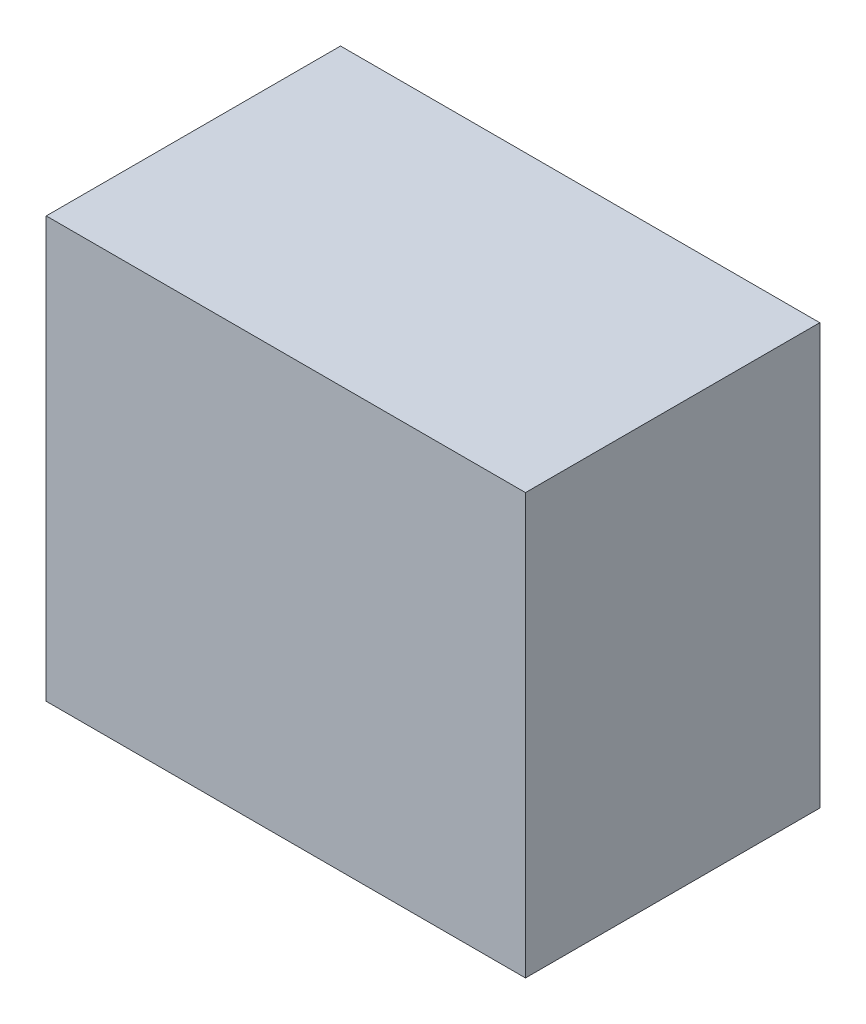
ISO-10303-21;
HEADER;
FILE_DESCRIPTION(('STEP AP214'),'2;1');
FILE_NAME('part.step','',(''),(''),'','','');
FILE_SCHEMA(('AUTOMOTIVE_DESIGN { 1 0 10303 214 1 1 1 1 }'));
ENDSEC;
DATA;
#1=APPLICATION_CONTEXT('core data for automotive mechanical design processes');
#2=APPLICATION_PROTOCOL_DEFINITION('international standard','automotive_design',2000,#1);
#3=PRODUCT_CONTEXT('',#1,'mechanical');
#4=PRODUCT('Part','Part','',(#3));
#5=PRODUCT_RELATED_PRODUCT_CATEGORY('part','',(#4));
#6=PRODUCT_DEFINITION_FORMATION('','',#4);
#7=PRODUCT_DEFINITION_CONTEXT('part definition',#1,'design');
#8=PRODUCT_DEFINITION('design','',#6,#7);
#9=PRODUCT_DEFINITION_SHAPE('','',#8);
#10=(LENGTH_UNIT() NAMED_UNIT(*) SI_UNIT(.MILLI.,.METRE.));
#11=(NAMED_UNIT(*) PLANE_ANGLE_UNIT() SI_UNIT($,.RADIAN.));
#12=(NAMED_UNIT(*) SI_UNIT($,.STERADIAN.) SOLID_ANGLE_UNIT());
#13=UNCERTAINTY_MEASURE_WITH_UNIT(LENGTH_MEASURE(1.E-05),#10,'distance_accuracy_value','');
#14=(GEOMETRIC_REPRESENTATION_CONTEXT(3) GLOBAL_UNCERTAINTY_ASSIGNED_CONTEXT((#13)) GLOBAL_UNIT_ASSIGNED_CONTEXT((#10,
#11,#12)) REPRESENTATION_CONTEXT('',''));
#15=CARTESIAN_POINT('',(0.,0.,0.));
#16=DIRECTION('',(0.,0.,1.));
#17=DIRECTION('',(1.,0.,0.));
#18=AXIS2_PLACEMENT_3D('',#15,#16,#17);
#19=CARTESIAN_POINT('',(28.5,50.,-17.5));
#20=DIRECTION('',(-1.,0.,0.));
#21=DIRECTION('',(0.,0.,1.));
#22=AXIS2_PLACEMENT_3D('',#19,#20,#21);
#23=PLANE('',#22);
#24=DIRECTION('',(0.,0.,-1.));
#25=VECTOR('',#24,1.);
#26=CARTESIAN_POINT('',(28.5,0.,-17.5));
#27=LINE('',#26,#25);
#28=CARTESIAN_POINT('',(28.5,0.,17.5));
#29=VERTEX_POINT('',#28);
#30=CARTESIAN_POINT('',(28.5,0.,-17.5));
#31=VERTEX_POINT('',#30);
#32=EDGE_CURVE('E148',#29,#31,#27,.T.);
#33=ORIENTED_EDGE('',*,*,#32,.T.);
#34=DIRECTION('',(0.,-1.,0.));
#35=VECTOR('',#34,1.);
#36=CARTESIAN_POINT('',(28.5,50.,-17.5));
#37=LINE('',#36,#35);
#38=CARTESIAN_POINT('',(28.5,50.,-17.5));
#39=VERTEX_POINT('',#38);
#40=EDGE_CURVE('E11',#39,#31,#37,.T.);
#41=ORIENTED_EDGE('',*,*,#40,.F.);
#42=DIRECTION('',(0.,0.,-1.));
#43=VECTOR('',#42,1.);
#44=CARTESIAN_POINT('',(28.5,50.,-17.5));
#45=LINE('',#44,#43);
#46=CARTESIAN_POINT('',(28.5,50.,17.5));
#47=VERTEX_POINT('',#46);
#48=EDGE_CURVE('E160',#47,#39,#45,.T.);
#49=ORIENTED_EDGE('',*,*,#48,.F.);
#50=DIRECTION('',(0.,-1.,0.));
#51=VECTOR('',#50,1.);
#52=CARTESIAN_POINT('',(28.5,50.,17.5));
#53=LINE('',#52,#51);
#54=EDGE_CURVE('E169',#47,#29,#53,.T.);
#55=ORIENTED_EDGE('',*,*,#54,.T.);
#56=EDGE_LOOP('',(#33,#41,#49,#55));
#57=FACE_BOUND('',#56,.T.);
#58=ADVANCED_FACE('F46',(#57),#23,.F.);
#59=CARTESIAN_POINT('',(-28.5,50.,-17.5));
#60=DIRECTION('',(0.,0.,1.));
#61=DIRECTION('',(1.,0.,0.));
#62=AXIS2_PLACEMENT_3D('',#59,#60,#61);
#63=PLANE('',#62);
#64=DIRECTION('',(-1.,0.,0.));
#65=VECTOR('',#64,1.);
#66=CARTESIAN_POINT('',(-28.5,0.,-17.5));
#67=LINE('',#66,#65);
#68=CARTESIAN_POINT('',(-28.5,0.,-17.5));
#69=VERTEX_POINT('',#68);
#70=EDGE_CURVE('E154',#31,#69,#67,.T.);
#71=ORIENTED_EDGE('',*,*,#70,.T.);
#72=DIRECTION('',(0.,-1.,0.));
#73=VECTOR('',#72,1.);
#74=CARTESIAN_POINT('',(-28.5,50.,-17.5));
#75=LINE('',#74,#73);
#76=CARTESIAN_POINT('',(-28.5,50.,-17.5));
#77=VERTEX_POINT('',#76);
#78=EDGE_CURVE('E55',#77,#69,#75,.T.);
#79=ORIENTED_EDGE('',*,*,#78,.F.);
#80=DIRECTION('',(-1.,0.,0.));
#81=VECTOR('',#80,1.);
#82=CARTESIAN_POINT('',(-28.5,50.,-17.5));
#83=LINE('',#82,#81);
#84=EDGE_CURVE('E94',#39,#77,#83,.T.);
#85=ORIENTED_EDGE('',*,*,#84,.F.);
#86=ORIENTED_EDGE('',*,*,#40,.T.);
#87=EDGE_LOOP('',(#71,#79,#85,#86));
#88=FACE_BOUND('',#87,.T.);
#89=ADVANCED_FACE('F199',(#88),#63,.F.);
#90=CARTESIAN_POINT('',(-28.5,50.,-17.5));
#91=DIRECTION('',(1.,0.,0.));
#92=DIRECTION('',(0.,0.,-1.));
#93=AXIS2_PLACEMENT_3D('',#90,#91,#92);
#94=PLANE('',#93);
#95=DIRECTION('',(0.,0.,1.));
#96=VECTOR('',#95,1.);
#97=CARTESIAN_POINT('',(-28.5,0.,-17.5));
#98=LINE('',#97,#96);
#99=CARTESIAN_POINT('',(-28.5,0.,17.5));
#100=VERTEX_POINT('',#99);
#101=EDGE_CURVE('E81',#69,#100,#98,.T.);
#102=ORIENTED_EDGE('',*,*,#101,.T.);
#103=DIRECTION('',(0.,-1.,0.));
#104=VECTOR('',#103,1.);
#105=CARTESIAN_POINT('',(-28.5,50.,17.5));
#106=LINE('',#105,#104);
#107=CARTESIAN_POINT('',(-28.5,50.,17.5));
#108=VERTEX_POINT('',#107);
#109=EDGE_CURVE('E179',#108,#100,#106,.T.);
#110=ORIENTED_EDGE('',*,*,#109,.F.);
#111=DIRECTION('',(0.,0.,1.));
#112=VECTOR('',#111,1.);
#113=CARTESIAN_POINT('',(-28.5,50.,-17.5));
#114=LINE('',#113,#112);
#115=EDGE_CURVE('E165',#77,#108,#114,.T.);
#116=ORIENTED_EDGE('',*,*,#115,.F.);
#117=ORIENTED_EDGE('',*,*,#78,.T.);
#118=EDGE_LOOP('',(#102,#110,#116,#117));
#119=FACE_BOUND('',#118,.T.);
#120=ADVANCED_FACE('F183',(#119),#94,.F.);
#121=CARTESIAN_POINT('',(-28.5,50.,17.5));
#122=DIRECTION('',(0.,0.,-1.));
#123=DIRECTION('',(-1.,0.,0.));
#124=AXIS2_PLACEMENT_3D('',#121,#122,#123);
#125=PLANE('',#124);
#126=DIRECTION('',(1.,0.,0.));
#127=VECTOR('',#126,1.);
#128=CARTESIAN_POINT('',(-28.5,0.,17.5));
#129=LINE('',#128,#127);
#130=EDGE_CURVE('E87',#100,#29,#129,.T.);
#131=ORIENTED_EDGE('',*,*,#130,.T.);
#132=ORIENTED_EDGE('',*,*,#54,.F.);
#133=DIRECTION('',(1.,0.,0.));
#134=VECTOR('',#133,1.);
#135=CARTESIAN_POINT('',(-28.5,50.,17.5));
#136=LINE('',#135,#134);
#137=EDGE_CURVE('E63',#108,#47,#136,.T.);
#138=ORIENTED_EDGE('',*,*,#137,.F.);
#139=ORIENTED_EDGE('',*,*,#109,.T.);
#140=EDGE_LOOP('',(#131,#132,#138,#139));
#141=FACE_BOUND('',#140,.T.);
#142=ADVANCED_FACE('F190',(#141),#125,.F.);
#143=CARTESIAN_POINT('',(0.,50.,0.));
#144=DIRECTION('',(0.,1.,0.));
#145=DIRECTION('',(0.,0.,1.));
#146=AXIS2_PLACEMENT_3D('',#143,#144,#145);
#147=PLANE('',#146);
#148=ORIENTED_EDGE('',*,*,#48,.T.);
#149=ORIENTED_EDGE('',*,*,#84,.T.);
#150=ORIENTED_EDGE('',*,*,#115,.T.);
#151=ORIENTED_EDGE('',*,*,#137,.T.);
#152=EDGE_LOOP('',(#148,#149,#150,#151));
#153=FACE_BOUND('',#152,.T.);
#154=ADVANCED_FACE('F192',(#153),#147,.T.);
#155=CARTESIAN_POINT('',(0.,0.,0.));
#156=DIRECTION('',(0.,1.,0.));
#157=DIRECTION('',(0.,0.,1.));
#158=AXIS2_PLACEMENT_3D('',#155,#156,#157);
#159=PLANE('',#158);
#160=ORIENTED_EDGE('',*,*,#32,.F.);
#161=ORIENTED_EDGE('',*,*,#130,.F.);
#162=ORIENTED_EDGE('',*,*,#101,.F.);
#163=ORIENTED_EDGE('',*,*,#70,.F.);
#164=EDGE_LOOP('',(#160,#161,#162,#163));
#165=FACE_BOUND('',#164,.T.);
#166=ADVANCED_FACE('F186',(#165),#159,.F.);
#167=CLOSED_SHELL('',(#58,#89,#120,#142,#154,#166));
#168=CARTESIAN_POINT('',(27.5,49.,-16.5));
#169=DIRECTION('',(-1.,0.,0.));
#170=DIRECTION('',(0.,0.,1.));
#171=AXIS2_PLACEMENT_3D('',#168,#169,#170);
#172=PLANE('',#171);
#173=DIRECTION('',(0.,0.,-1.));
#174=VECTOR('',#173,1.);
#175=CARTESIAN_POINT('',(27.5,1.,-16.5));
#176=LINE('',#175,#174);
#177=CARTESIAN_POINT('',(27.5,1.,16.5));
#178=VERTEX_POINT('',#177);
#179=CARTESIAN_POINT('',(27.5,1.,-16.5));
#180=VERTEX_POINT('',#179);
#181=EDGE_CURVE('E290',#178,#180,#176,.T.);
#182=ORIENTED_EDGE('',*,*,#181,.F.);
#183=DIRECTION('',(0.,-1.,0.));
#184=VECTOR('',#183,1.);
#185=CARTESIAN_POINT('',(27.5,49.,16.5));
#186=LINE('',#185,#184);
#187=CARTESIAN_POINT('',(27.5,49.,16.5));
#188=VERTEX_POINT('',#187);
#189=EDGE_CURVE('E141',#188,#178,#186,.T.);
#190=ORIENTED_EDGE('',*,*,#189,.F.);
#191=DIRECTION('',(0.,0.,-1.));
#192=VECTOR('',#191,1.);
#193=CARTESIAN_POINT('',(27.5,49.,-16.5));
#194=LINE('',#193,#192);
#195=CARTESIAN_POINT('',(27.5,49.,-16.5));
#196=VERTEX_POINT('',#195);
#197=EDGE_CURVE('E125',#188,#196,#194,.T.);
#198=ORIENTED_EDGE('',*,*,#197,.T.);
#199=DIRECTION('',(0.,-1.,0.));
#200=VECTOR('',#199,1.);
#201=CARTESIAN_POINT('',(27.5,49.,-16.5));
#202=LINE('',#201,#200);
#203=EDGE_CURVE('E138',#196,#180,#202,.T.);
#204=ORIENTED_EDGE('',*,*,#203,.T.);
#205=EDGE_LOOP('',(#182,#190,#198,#204));
#206=FACE_BOUND('',#205,.T.);
#207=ADVANCED_FACE('F137',(#206),#172,.T.);
#208=CARTESIAN_POINT('',(-27.5,49.,-16.5));
#209=DIRECTION('',(0.,0.,1.));
#210=DIRECTION('',(1.,0.,0.));
#211=AXIS2_PLACEMENT_3D('',#208,#209,#210);
#212=PLANE('',#211);
#213=DIRECTION('',(-1.,0.,0.));
#214=VECTOR('',#213,1.);
#215=CARTESIAN_POINT('',(-27.5,1.,-16.5));
#216=LINE('',#215,#214);
#217=CARTESIAN_POINT('',(-27.5,1.,-16.5));
#218=VERTEX_POINT('',#217);
#219=EDGE_CURVE('E146',#180,#218,#216,.T.);
#220=ORIENTED_EDGE('',*,*,#219,.F.);
#221=ORIENTED_EDGE('',*,*,#203,.F.);
#222=DIRECTION('',(-1.,0.,0.));
#223=VECTOR('',#222,1.);
#224=CARTESIAN_POINT('',(-27.5,49.,-16.5));
#225=LINE('',#224,#223);
#226=CARTESIAN_POINT('',(-27.5,49.,-16.5));
#227=VERTEX_POINT('',#226);
#228=EDGE_CURVE('E121',#196,#227,#225,.T.);
#229=ORIENTED_EDGE('',*,*,#228,.T.);
#230=DIRECTION('',(0.,-1.,0.));
#231=VECTOR('',#230,1.);
#232=CARTESIAN_POINT('',(-27.5,49.,-16.5));
#233=LINE('',#232,#231);
#234=EDGE_CURVE('E149',#227,#218,#233,.T.);
#235=ORIENTED_EDGE('',*,*,#234,.T.);
#236=EDGE_LOOP('',(#220,#221,#229,#235));
#237=FACE_BOUND('',#236,.T.);
#238=ADVANCED_FACE('F145',(#237),#212,.T.);
#239=CARTESIAN_POINT('',(-27.5,49.,-16.5));
#240=DIRECTION('',(1.,0.,0.));
#241=DIRECTION('',(0.,0.,-1.));
#242=AXIS2_PLACEMENT_3D('',#239,#240,#241);
#243=PLANE('',#242);
#244=DIRECTION('',(0.,0.,1.));
#245=VECTOR('',#244,1.);
#246=CARTESIAN_POINT('',(-27.5,1.,-16.5));
#247=LINE('',#246,#245);
#248=CARTESIAN_POINT('',(-27.5,1.,16.5));
#249=VERTEX_POINT('',#248);
#250=EDGE_CURVE('E295',#218,#249,#247,.T.);
#251=ORIENTED_EDGE('',*,*,#250,.F.);
#252=ORIENTED_EDGE('',*,*,#234,.F.);
#253=DIRECTION('',(0.,0.,1.));
#254=VECTOR('',#253,1.);
#255=CARTESIAN_POINT('',(-27.5,49.,-16.5));
#256=LINE('',#255,#254);
#257=CARTESIAN_POINT('',(-27.5,49.,16.5));
#258=VERTEX_POINT('',#257);
#259=EDGE_CURVE('E126',#227,#258,#256,.T.);
#260=ORIENTED_EDGE('',*,*,#259,.T.);
#261=DIRECTION('',(0.,-1.,0.));
#262=VECTOR('',#261,1.);
#263=CARTESIAN_POINT('',(-27.5,49.,16.5));
#264=LINE('',#263,#262);
#265=EDGE_CURVE('E156',#258,#249,#264,.T.);
#266=ORIENTED_EDGE('',*,*,#265,.T.);
#267=EDGE_LOOP('',(#251,#252,#260,#266));
#268=FACE_BOUND('',#267,.T.);
#269=ADVANCED_FACE('F249',(#268),#243,.T.);
#270=CARTESIAN_POINT('',(-27.5,49.,16.5));
#271=DIRECTION('',(0.,0.,-1.));
#272=DIRECTION('',(-1.,0.,0.));
#273=AXIS2_PLACEMENT_3D('',#270,#271,#272);
#274=PLANE('',#273);
#275=DIRECTION('',(1.,0.,0.));
#276=VECTOR('',#275,1.);
#277=CARTESIAN_POINT('',(-27.5,1.,16.5));
#278=LINE('',#277,#276);
#279=EDGE_CURVE('E143',#249,#178,#278,.T.);
#280=ORIENTED_EDGE('',*,*,#279,.F.);
#281=ORIENTED_EDGE('',*,*,#265,.F.);
#282=DIRECTION('',(1.,0.,0.));
#283=VECTOR('',#282,1.);
#284=CARTESIAN_POINT('',(-27.5,49.,16.5));
#285=LINE('',#284,#283);
#286=EDGE_CURVE('E298',#258,#188,#285,.T.);
#287=ORIENTED_EDGE('',*,*,#286,.T.);
#288=ORIENTED_EDGE('',*,*,#189,.T.);
#289=EDGE_LOOP('',(#280,#281,#287,#288));
#290=FACE_BOUND('',#289,.T.);
#291=ADVANCED_FACE('F258',(#290),#274,.T.);
#292=CARTESIAN_POINT('',(0.,49.,0.));
#293=DIRECTION('',(0.,1.,0.));
#294=DIRECTION('',(0.,0.,1.));
#295=AXIS2_PLACEMENT_3D('',#292,#293,#294);
#296=PLANE('',#295);
#297=ORIENTED_EDGE('',*,*,#197,.F.);
#298=ORIENTED_EDGE('',*,*,#286,.F.);
#299=ORIENTED_EDGE('',*,*,#259,.F.);
#300=ORIENTED_EDGE('',*,*,#228,.F.);
#301=EDGE_LOOP('',(#297,#298,#299,#300));
#302=FACE_BOUND('',#301,.T.);
#303=ADVANCED_FACE('F123',(#302),#296,.F.);
#304=CARTESIAN_POINT('',(0.,1.,0.));
#305=DIRECTION('',(0.,1.,0.));
#306=DIRECTION('',(0.,0.,1.));
#307=AXIS2_PLACEMENT_3D('',#304,#305,#306);
#308=PLANE('',#307);
#309=ORIENTED_EDGE('',*,*,#181,.T.);
#310=ORIENTED_EDGE('',*,*,#219,.T.);
#311=ORIENTED_EDGE('',*,*,#250,.T.);
#312=ORIENTED_EDGE('',*,*,#279,.T.);
#313=EDGE_LOOP('',(#309,#310,#311,#312));
#314=FACE_BOUND('',#313,.T.);
#315=ADVANCED_FACE('F277',(#314),#308,.T.);
#316=CLOSED_SHELL('',(#207,#238,#269,#291,#303,#315));
#317=ORIENTED_CLOSED_SHELL('',*,#316,.T.);
#318=BREP_WITH_VOIDS('B2',#167,(#317));
#319=ADVANCED_BREP_SHAPE_REPRESENTATION('',(#18,#318),#14);
#320=SHAPE_DEFINITION_REPRESENTATION(#9,#319);
ENDSEC;
END-ISO-10303-21;
